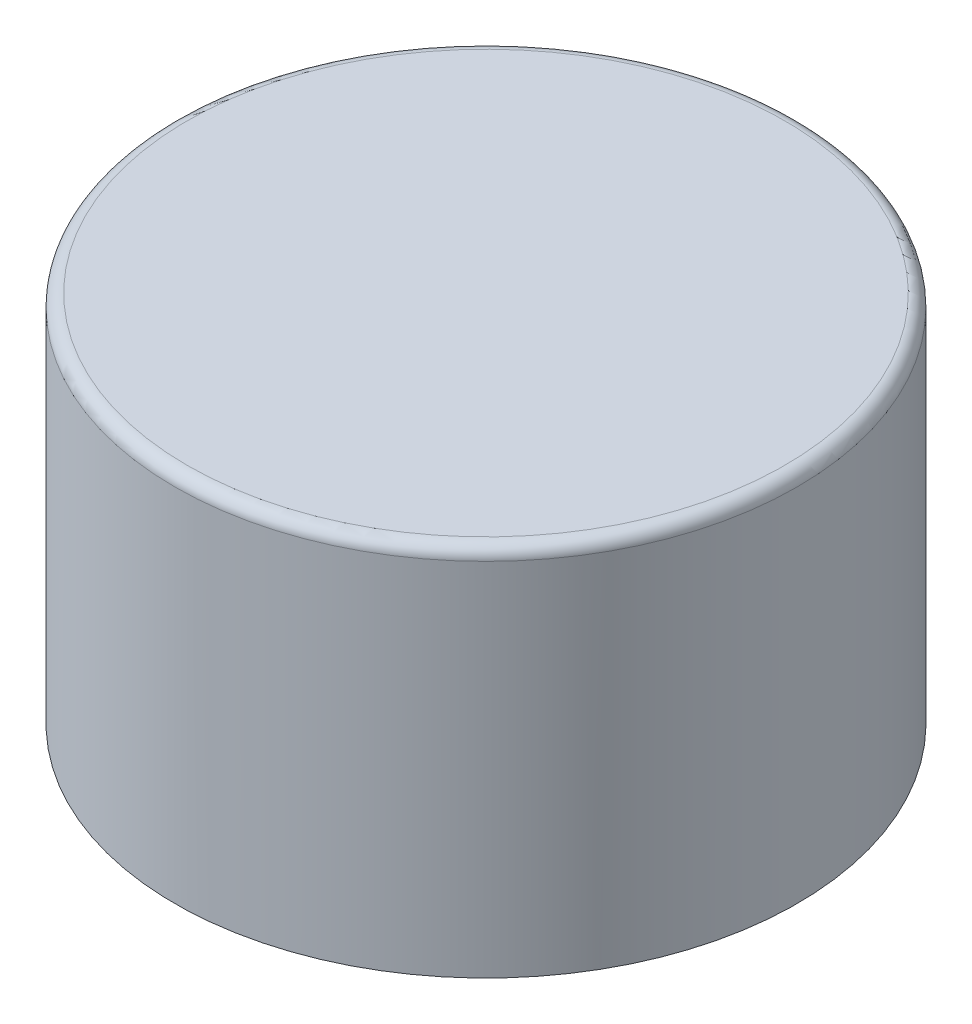
ISO-10303-21;
HEADER;
FILE_DESCRIPTION(('STEP AP214'),'2;1');
FILE_NAME('part.step','',(''),(''),'','','');
FILE_SCHEMA(('AUTOMOTIVE_DESIGN { 1 0 10303 214 1 1 1 1 }'));
ENDSEC;
DATA;
#1=APPLICATION_CONTEXT('core data for automotive mechanical design processes');
#2=APPLICATION_PROTOCOL_DEFINITION('international standard','automotive_design',2000,#1);
#3=PRODUCT_CONTEXT('',#1,'mechanical');
#4=PRODUCT('Part','Part','',(#3));
#5=PRODUCT_RELATED_PRODUCT_CATEGORY('part','',(#4));
#6=PRODUCT_DEFINITION_FORMATION('','',#4);
#7=PRODUCT_DEFINITION_CONTEXT('part definition',#1,'design');
#8=PRODUCT_DEFINITION('design','',#6,#7);
#9=PRODUCT_DEFINITION_SHAPE('','',#8);
#10=(LENGTH_UNIT() NAMED_UNIT(*) SI_UNIT(.MILLI.,.METRE.));
#11=(NAMED_UNIT(*) PLANE_ANGLE_UNIT() SI_UNIT($,.RADIAN.));
#12=(NAMED_UNIT(*) SI_UNIT($,.STERADIAN.) SOLID_ANGLE_UNIT());
#13=UNCERTAINTY_MEASURE_WITH_UNIT(LENGTH_MEASURE(1.E-05),#10,'distance_accuracy_value','');
#14=(GEOMETRIC_REPRESENTATION_CONTEXT(3) GLOBAL_UNCERTAINTY_ASSIGNED_CONTEXT((#13)) GLOBAL_UNIT_ASSIGNED_CONTEXT((#10,
#11,#12)) REPRESENTATION_CONTEXT('',''));
#15=CARTESIAN_POINT('',(0.,0.,0.));
#16=DIRECTION('',(0.,0.,1.));
#17=DIRECTION('',(1.,0.,0.));
#18=AXIS2_PLACEMENT_3D('',#15,#16,#17);
#19=CARTESIAN_POINT('',(0.,76.2,0.));
#20=DIRECTION('',(0.,-1.,0.));
#21=DIRECTION('',(0.,0.,-1.));
#22=AXIS2_PLACEMENT_3D('',#19,#20,#21);
#23=CYLINDRICAL_SURFACE('',#22,63.5);
#24=CARTESIAN_POINT('',(0.,73.66,0.));
#25=DIRECTION('',(0.,1.,0.));
#26=DIRECTION('',(0.,0.,1.));
#27=AXIS2_PLACEMENT_3D('',#24,#25,#26);
#28=CIRCLE('',#27,63.5);
#29=CARTESIAN_POINT('',(0.,73.66,-63.5));
#30=VERTEX_POINT('',#29);
#31=EDGE_CURVE('E10',#30,#30,#28,.F.);
#32=CARTESIAN_POINT('',(0.,0.,0.));
#33=DIRECTION('',(0.,1.,0.));
#34=DIRECTION('',(0.,0.,1.));
#35=AXIS2_PLACEMENT_3D('',#32,#33,#34);
#36=CIRCLE('',#35,63.5);
#37=CARTESIAN_POINT('',(0.,0.,-63.5));
#38=VERTEX_POINT('',#37);
#39=EDGE_CURVE('E50',#38,#38,#36,.T.);
#40=CARTESIAN_POINT('',(0.,73.66,-63.5));
#41=CARTESIAN_POINT('',(0.,72.8927083333333,-63.5));
#42=CARTESIAN_POINT('',(0.,72.1254166666667,-63.5));
#43=CARTESIAN_POINT('',(0.,70.5908333333333,-63.5));
#44=CARTESIAN_POINT('',(0.,69.8235416666667,-63.5));
#45=CARTESIAN_POINT('',(0.,68.2889583333333,-63.5));
#46=CARTESIAN_POINT('',(0.,67.5216666666667,-63.5));
#47=CARTESIAN_POINT('',(0.,65.9870833333333,-63.5));
#48=CARTESIAN_POINT('',(0.,65.2197916666667,-63.5));
#49=CARTESIAN_POINT('',(0.,63.6852083333333,-63.5));
#50=CARTESIAN_POINT('',(0.,62.9179166666667,-63.5));
#51=CARTESIAN_POINT('',(0.,61.3833333333333,-63.5));
#52=CARTESIAN_POINT('',(0.,60.6160416666667,-63.5));
#53=CARTESIAN_POINT('',(0.,59.0814583333333,-63.5));
#54=CARTESIAN_POINT('',(0.,58.3141666666667,-63.5));
#55=CARTESIAN_POINT('',(0.,56.7795833333333,-63.5));
#56=CARTESIAN_POINT('',(0.,56.0122916666667,-63.5));
#57=CARTESIAN_POINT('',(0.,54.4777083333333,-63.5));
#58=CARTESIAN_POINT('',(0.,53.7104166666667,-63.5));
#59=CARTESIAN_POINT('',(0.,52.1758333333333,-63.5));
#60=CARTESIAN_POINT('',(0.,51.4085416666667,-63.5));
#61=CARTESIAN_POINT('',(0.,49.8739583333333,-63.5));
#62=CARTESIAN_POINT('',(0.,49.1066666666667,-63.5));
#63=CARTESIAN_POINT('',(0.,47.5720833333333,-63.5));
#64=CARTESIAN_POINT('',(0.,46.8047916666667,-63.5));
#65=CARTESIAN_POINT('',(0.,45.2702083333333,-63.5));
#66=CARTESIAN_POINT('',(0.,44.5029166666667,-63.5));
#67=CARTESIAN_POINT('',(0.,42.9683333333333,-63.5));
#68=CARTESIAN_POINT('',(0.,42.2010416666667,-63.5));
#69=CARTESIAN_POINT('',(0.,40.6664583333333,-63.5));
#70=CARTESIAN_POINT('',(0.,39.8991666666667,-63.5));
#71=CARTESIAN_POINT('',(0.,38.3645833333333,-63.5));
#72=CARTESIAN_POINT('',(0.,37.5972916666667,-63.5));
#73=CARTESIAN_POINT('',(0.,36.0627083333333,-63.5));
#74=CARTESIAN_POINT('',(0.,35.2954166666667,-63.5));
#75=CARTESIAN_POINT('',(0.,33.7608333333333,-63.5));
#76=CARTESIAN_POINT('',(0.,32.9935416666667,-63.5));
#77=CARTESIAN_POINT('',(0.,31.4589583333333,-63.5));
#78=CARTESIAN_POINT('',(0.,30.6916666666667,-63.5));
#79=CARTESIAN_POINT('',(0.,29.1570833333333,-63.5));
#80=CARTESIAN_POINT('',(0.,28.3897916666667,-63.5));
#81=CARTESIAN_POINT('',(0.,26.8552083333333,-63.5));
#82=CARTESIAN_POINT('',(0.,26.0879166666667,-63.5));
#83=CARTESIAN_POINT('',(0.,24.5533333333333,-63.5));
#84=CARTESIAN_POINT('',(0.,23.7860416666667,-63.5));
#85=CARTESIAN_POINT('',(0.,22.2514583333333,-63.5));
#86=CARTESIAN_POINT('',(0.,21.4841666666667,-63.5));
#87=CARTESIAN_POINT('',(0.,19.9495833333333,-63.5));
#88=CARTESIAN_POINT('',(0.,19.1822916666667,-63.5));
#89=CARTESIAN_POINT('',(0.,17.6477083333333,-63.5));
#90=CARTESIAN_POINT('',(0.,16.8804166666667,-63.5));
#91=CARTESIAN_POINT('',(0.,15.3458333333333,-63.5));
#92=CARTESIAN_POINT('',(0.,14.5785416666667,-63.5));
#93=CARTESIAN_POINT('',(0.,13.0439583333333,-63.5));
#94=CARTESIAN_POINT('',(0.,12.2766666666667,-63.5));
#95=CARTESIAN_POINT('',(0.,10.7420833333333,-63.5));
#96=CARTESIAN_POINT('',(0.,9.97479166666667,-63.5));
#97=CARTESIAN_POINT('',(0.,8.44020833333334,-63.5));
#98=CARTESIAN_POINT('',(0.,7.67291666666667,-63.5));
#99=CARTESIAN_POINT('',(0.,6.13833333333333,-63.5));
#100=CARTESIAN_POINT('',(0.,5.37104166666667,-63.5));
#101=CARTESIAN_POINT('',(0.,3.83645833333333,-63.5));
#102=CARTESIAN_POINT('',(0.,3.06916666666666,-63.5));
#103=CARTESIAN_POINT('',(0.,1.53458333333333,-63.5));
#104=CARTESIAN_POINT('',(0.,0.767291666666665,-63.5));
#105=CARTESIAN_POINT('',(0.,0.,-63.5));
#106=B_SPLINE_CURVE_WITH_KNOTS('',3,(#40,#41,#42,#43,#44,#45,#46,#47,#48,#49,#50,#51,#52,#53,
#54,#55,#56,#57,#58,#59,#60,#61,#62,#63,#64,#65,#66,#67,#68,#69,#70,#71,#72,#73,#74,#75,#76,#77,
#78,#79,#80,#81,#82,#83,#84,#85,#86,#87,#88,#89,#90,#91,#92,#93,#94,#95,#96,#97,#98,#99,#100,
#101,#102,#103,#104,#105),.UNSPECIFIED.,.F.,.F.,(4,2,2,2,2,2,2,2,2,2,2,2,2,2,2,2,2,2,2,2,2,2,2,
2,2,2,2,2,2,2,2,2,4),(0.,2.301875,4.60374999999999,6.905625,9.20749999999999,11.509375,13.81125,
16.113125,18.415,20.716875,23.01875,25.320625,27.6225,29.924375,32.22625,34.528125,36.83,
39.131875,41.43375,43.735625,46.0375,48.339375,50.64125,52.943125,55.245,57.546875,59.84875,
62.150625,64.4525,66.754375,69.05625,71.358125,73.66),.UNSPECIFIED.);
#107=EDGE_CURVE('BSEAM37',#30,#38,#106,.T.);
#108=ORIENTED_EDGE('',*,*,#31,.T.);
#109=ORIENTED_EDGE('',*,*,#39,.T.);
#110=ORIENTED_EDGE('',*,*,#107,.T.);
#111=ORIENTED_EDGE('',*,*,#107,.F.);
#112=EDGE_LOOP('',(#108,#110,#109,#111));
#113=FACE_BOUND('',#112,.T.);
#114=ADVANCED_FACE('F37',(#113),#23,.T.);
#115=CARTESIAN_POINT('',(0.,76.2,0.));
#116=DIRECTION('',(0.,1.,0.));
#117=DIRECTION('',(0.,0.,1.));
#118=AXIS2_PLACEMENT_3D('',#115,#116,#117);
#119=PLANE('',#118);
#120=CARTESIAN_POINT('',(0.,76.2,0.));
#121=DIRECTION('',(0.,1.,0.));
#122=DIRECTION('',(0.,0.,1.));
#123=AXIS2_PLACEMENT_3D('',#120,#121,#122);
#124=CIRCLE('',#123,60.96);
#125=CARTESIAN_POINT('',(0.,76.2,60.96));
#126=VERTEX_POINT('',#125);
#127=EDGE_CURVE('E45',#126,#126,#124,.T.);
#128=ORIENTED_EDGE('',*,*,#127,.T.);
#129=EDGE_LOOP('',(#128));
#130=FACE_BOUND('',#129,.T.);
#131=ADVANCED_FACE('F81',(#130),#119,.T.);
#132=CARTESIAN_POINT('',(0.,0.,0.));
#133=DIRECTION('',(0.,1.,0.));
#134=DIRECTION('',(0.,0.,1.));
#135=AXIS2_PLACEMENT_3D('',#132,#133,#134);
#136=PLANE('',#135);
#137=CARTESIAN_POINT('',(0.,0.,0.));
#138=DIRECTION('',(0.,1.,0.));
#139=DIRECTION('',(0.,0.,1.));
#140=AXIS2_PLACEMENT_3D('',#137,#138,#139);
#141=CIRCLE('',#140,57.15);
#142=CARTESIAN_POINT('',(0.,0.,-57.15));
#143=VERTEX_POINT('',#142);
#144=EDGE_CURVE('E58',#143,#143,#141,.T.);
#145=ORIENTED_EDGE('',*,*,#144,.T.);
#146=EDGE_LOOP('',(#145));
#147=FACE_BOUND('',#146,.T.);
#148=ORIENTED_EDGE('',*,*,#39,.F.);
#149=EDGE_LOOP('',(#148));
#150=FACE_BOUND('',#149,.T.);
#151=ADVANCED_FACE('F77',(#147,#150),#136,.F.);
#152=CARTESIAN_POINT('',(0.,76.2,0.));
#153=DIRECTION('',(0.,-1.,0.));
#154=DIRECTION('',(0.,0.,-1.));
#155=AXIS2_PLACEMENT_3D('',#152,#153,#154);
#156=CYLINDRICAL_SURFACE('',#155,57.15);
#157=CARTESIAN_POINT('',(0.,69.85,0.));
#158=DIRECTION('',(0.,1.,0.));
#159=DIRECTION('',(0.,0.,1.));
#160=AXIS2_PLACEMENT_3D('',#157,#158,#159);
#161=CIRCLE('',#160,57.15);
#162=CARTESIAN_POINT('',(0.,69.85,-57.15));
#163=VERTEX_POINT('',#162);
#164=EDGE_CURVE('E55',#163,#163,#161,.T.);
#165=CARTESIAN_POINT('',(0.,69.85,-57.15));
#166=CARTESIAN_POINT('',(0.,69.1223958333333,-57.15));
#167=CARTESIAN_POINT('',(0.,68.3947916666667,-57.15));
#168=CARTESIAN_POINT('',(0.,66.9395833333333,-57.15));
#169=CARTESIAN_POINT('',(0.,66.2119791666667,-57.15));
#170=CARTESIAN_POINT('',(0.,64.7567708333333,-57.15));
#171=CARTESIAN_POINT('',(0.,64.0291666666667,-57.15));
#172=CARTESIAN_POINT('',(0.,62.5739583333333,-57.15));
#173=CARTESIAN_POINT('',(0.,61.8463541666667,-57.15));
#174=CARTESIAN_POINT('',(0.,60.3911458333333,-57.15));
#175=CARTESIAN_POINT('',(0.,59.6635416666667,-57.15));
#176=CARTESIAN_POINT('',(0.,58.2083333333333,-57.15));
#177=CARTESIAN_POINT('',(0.,57.4807291666667,-57.15));
#178=CARTESIAN_POINT('',(0.,56.0255208333333,-57.15));
#179=CARTESIAN_POINT('',(0.,55.2979166666667,-57.15));
#180=CARTESIAN_POINT('',(0.,53.8427083333333,-57.15));
#181=CARTESIAN_POINT('',(0.,53.1151041666667,-57.15));
#182=CARTESIAN_POINT('',(0.,51.6598958333333,-57.15));
#183=CARTESIAN_POINT('',(0.,50.9322916666667,-57.15));
#184=CARTESIAN_POINT('',(0.,49.4770833333333,-57.15));
#185=CARTESIAN_POINT('',(0.,48.7494791666667,-57.15));
#186=CARTESIAN_POINT('',(0.,47.2942708333333,-57.15));
#187=CARTESIAN_POINT('',(0.,46.5666666666667,-57.15));
#188=CARTESIAN_POINT('',(0.,45.1114583333333,-57.15));
#189=CARTESIAN_POINT('',(0.,44.3838541666667,-57.15));
#190=CARTESIAN_POINT('',(0.,42.9286458333333,-57.15));
#191=CARTESIAN_POINT('',(0.,42.2010416666667,-57.15));
#192=CARTESIAN_POINT('',(0.,40.7458333333333,-57.15));
#193=CARTESIAN_POINT('',(0.,40.0182291666667,-57.15));
#194=CARTESIAN_POINT('',(0.,38.5630208333333,-57.15));
#195=CARTESIAN_POINT('',(0.,37.8354166666667,-57.15));
#196=CARTESIAN_POINT('',(0.,36.3802083333333,-57.15));
#197=CARTESIAN_POINT('',(0.,35.6526041666667,-57.15));
#198=CARTESIAN_POINT('',(0.,34.1973958333333,-57.15));
#199=CARTESIAN_POINT('',(0.,33.4697916666667,-57.15));
#200=CARTESIAN_POINT('',(0.,32.0145833333333,-57.15));
#201=CARTESIAN_POINT('',(0.,31.2869791666667,-57.15));
#202=CARTESIAN_POINT('',(0.,29.8317708333333,-57.15));
#203=CARTESIAN_POINT('',(0.,29.1041666666667,-57.15));
#204=CARTESIAN_POINT('',(0.,27.6489583333333,-57.15));
#205=CARTESIAN_POINT('',(0.,26.9213541666667,-57.15));
#206=CARTESIAN_POINT('',(0.,25.4661458333333,-57.15));
#207=CARTESIAN_POINT('',(0.,24.7385416666667,-57.15));
#208=CARTESIAN_POINT('',(0.,23.2833333333333,-57.15));
#209=CARTESIAN_POINT('',(0.,22.5557291666667,-57.15));
#210=CARTESIAN_POINT('',(0.,21.1005208333333,-57.15));
#211=CARTESIAN_POINT('',(0.,20.3729166666667,-57.15));
#212=CARTESIAN_POINT('',(0.,18.9177083333333,-57.15));
#213=CARTESIAN_POINT('',(0.,18.1901041666667,-57.15));
#214=CARTESIAN_POINT('',(0.,16.7348958333333,-57.15));
#215=CARTESIAN_POINT('',(0.,16.0072916666667,-57.15));
#216=CARTESIAN_POINT('',(0.,14.5520833333333,-57.15));
#217=CARTESIAN_POINT('',(0.,13.8244791666667,-57.15));
#218=CARTESIAN_POINT('',(0.,12.3692708333333,-57.15));
#219=CARTESIAN_POINT('',(0.,11.6416666666667,-57.15));
#220=CARTESIAN_POINT('',(0.,10.1864583333333,-57.15));
#221=CARTESIAN_POINT('',(0.,9.45885416666666,-57.15));
#222=CARTESIAN_POINT('',(0.,8.00364583333333,-57.15));
#223=CARTESIAN_POINT('',(0.,7.27604166666667,-57.15));
#224=CARTESIAN_POINT('',(0.,5.82083333333333,-57.15));
#225=CARTESIAN_POINT('',(0.,5.09322916666666,-57.15));
#226=CARTESIAN_POINT('',(0.,3.63802083333332,-57.15));
#227=CARTESIAN_POINT('',(0.,2.91041666666666,-57.15));
#228=CARTESIAN_POINT('',(0.,1.45520833333333,-57.15));
#229=CARTESIAN_POINT('',(0.,0.727604166666664,-57.15));
#230=CARTESIAN_POINT('',(0.,0.,-57.15));
#231=B_SPLINE_CURVE_WITH_KNOTS('',3,(#165,#166,#167,#168,#169,#170,#171,#172,#173,#174,#175,
#176,#177,#178,#179,#180,#181,#182,#183,#184,#185,#186,#187,#188,#189,#190,#191,#192,#193,#194,
#195,#196,#197,#198,#199,#200,#201,#202,#203,#204,#205,#206,#207,#208,#209,#210,#211,#212,#213,
#214,#215,#216,#217,#218,#219,#220,#221,#222,#223,#224,#225,#226,#227,#228,#229,#230),
.UNSPECIFIED.,.F.,.F.,(4,2,2,2,2,2,2,2,2,2,2,2,2,2,2,2,2,2,2,2,2,2,2,2,2,2,2,2,2,2,2,2,4),(0.,
2.18281250000001,4.36562500000001,6.5484375,8.73125000000001,10.9140625,13.096875,15.2796875,
17.4625,19.6453125,21.828125,24.0109375,26.19375,28.3765625,30.559375,32.7421875,34.925,
37.1078125,39.290625,41.4734375,43.65625,45.8390625,48.021875,50.2046875,52.3875,54.5703125,
56.753125,58.9359375,61.11875,63.3015625,65.484375,67.6671875,69.85),.UNSPECIFIED.);
#232=EDGE_CURVE('BSEAM66',#163,#143,#231,.T.);
#233=ORIENTED_EDGE('',*,*,#164,.T.);
#234=ORIENTED_EDGE('',*,*,#144,.F.);
#235=ORIENTED_EDGE('',*,*,#232,.T.);
#236=ORIENTED_EDGE('',*,*,#232,.F.);
#237=EDGE_LOOP('',(#233,#235,#234,#236));
#238=FACE_BOUND('',#237,.T.);
#239=ADVANCED_FACE('F66',(#238),#156,.F.);
#240=CARTESIAN_POINT('',(0.,69.85,0.));
#241=DIRECTION('',(0.,1.,0.));
#242=DIRECTION('',(0.,0.,1.));
#243=AXIS2_PLACEMENT_3D('',#240,#241,#242);
#244=PLANE('',#243);
#245=ORIENTED_EDGE('',*,*,#164,.F.);
#246=EDGE_LOOP('',(#245));
#247=FACE_BOUND('',#246,.T.);
#248=ADVANCED_FACE('F69',(#247),#244,.F.);
#249=CARTESIAN_POINT('',(0.,73.66,0.));
#250=DIRECTION('',(0.,1.,0.));
#251=DIRECTION('',(0.,0.,1.));
#252=AXIS2_PLACEMENT_3D('',#249,#250,#251);
#253=TOROIDAL_SURFACE('',#252,60.96,2.54);
#254=ORIENTED_EDGE('',*,*,#31,.F.);
#255=EDGE_LOOP('',(#254));
#256=FACE_BOUND('',#255,.T.);
#257=ORIENTED_EDGE('',*,*,#127,.F.);
#258=EDGE_LOOP('',(#257));
#259=FACE_BOUND('',#258,.T.);
#260=ADVANCED_FACE('F39',(#256,#259),#253,.T.);
#261=CLOSED_SHELL('',(#114,#131,#151,#239,#248,#260));
#262=MANIFOLD_SOLID_BREP('B2',#261);
#263=ADVANCED_BREP_SHAPE_REPRESENTATION('',(#18,#262),#14);
#264=SHAPE_DEFINITION_REPRESENTATION(#9,#263);
ENDSEC;
END-ISO-10303-21;
